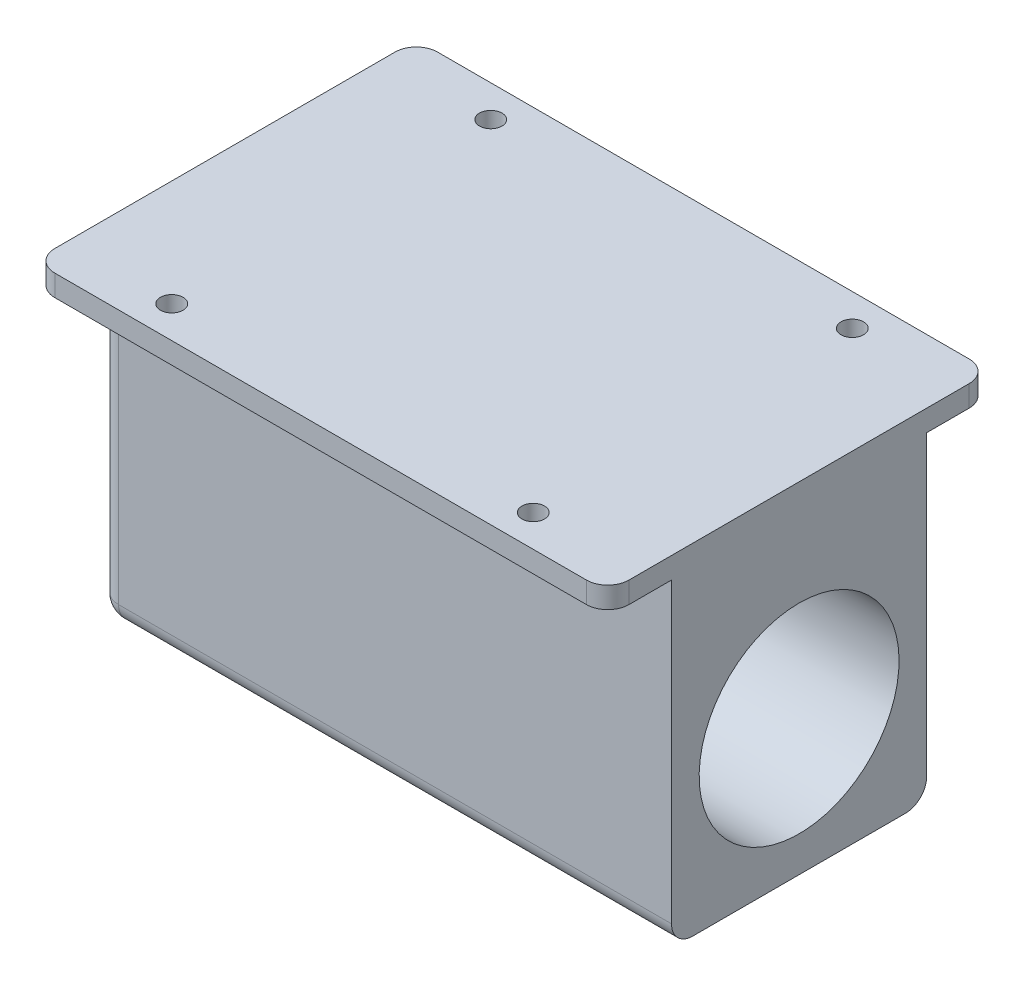
ISO-10303-21;
HEADER;
FILE_DESCRIPTION(('STEP AP214'),'2;1');
FILE_NAME('part.step','',(''),(''),'','','');
FILE_SCHEMA(('AUTOMOTIVE_DESIGN { 1 0 10303 214 1 1 1 1 }'));
ENDSEC;
DATA;
#1=APPLICATION_CONTEXT('core data for automotive mechanical design processes');
#2=APPLICATION_PROTOCOL_DEFINITION('international standard','automotive_design',2000,#1);
#3=PRODUCT_CONTEXT('',#1,'mechanical');
#4=PRODUCT('Part','Part','',(#3));
#5=PRODUCT_RELATED_PRODUCT_CATEGORY('part','',(#4));
#6=PRODUCT_DEFINITION_FORMATION('','',#4);
#7=PRODUCT_DEFINITION_CONTEXT('part definition',#1,'design');
#8=PRODUCT_DEFINITION('design','',#6,#7);
#9=PRODUCT_DEFINITION_SHAPE('','',#8);
#10=(LENGTH_UNIT() NAMED_UNIT(*) SI_UNIT(.MILLI.,.METRE.));
#11=(NAMED_UNIT(*) PLANE_ANGLE_UNIT() SI_UNIT($,.RADIAN.));
#12=(NAMED_UNIT(*) SI_UNIT($,.STERADIAN.) SOLID_ANGLE_UNIT());
#13=UNCERTAINTY_MEASURE_WITH_UNIT(LENGTH_MEASURE(1.E-05),#10,'distance_accuracy_value','');
#14=(GEOMETRIC_REPRESENTATION_CONTEXT(3) GLOBAL_UNCERTAINTY_ASSIGNED_CONTEXT((#13)) GLOBAL_UNIT_ASSIGNED_CONTEXT((#10,
#11,#12)) REPRESENTATION_CONTEXT('',''));
#15=CARTESIAN_POINT('',(0.,0.,0.));
#16=DIRECTION('',(0.,0.,1.));
#17=DIRECTION('',(1.,0.,0.));
#18=AXIS2_PLACEMENT_3D('',#15,#16,#17);
#19=CARTESIAN_POINT('',(0.,0.,60.));
#20=DIRECTION('',(0.,0.,1.));
#21=DIRECTION('',(1.,0.,0.));
#22=AXIS2_PLACEMENT_3D('',#19,#20,#21);
#23=PLANE('',#22);
#24=DIRECTION('',(0.,-1.,0.));
#25=VECTOR('',#24,1.);
#26=CARTESIAN_POINT('',(5.00000000000001,-80.,60.));
#27=LINE('',#26,#25);
#28=CARTESIAN_POINT('',(5.,-5.,60.));
#29=VERTEX_POINT('',#28);
#30=CARTESIAN_POINT('',(5.00000000000001,-75.,60.));
#31=VERTEX_POINT('',#30);
#32=EDGE_CURVE('E261',#29,#31,#27,.T.);
#33=ORIENTED_EDGE('',*,*,#32,.T.);
#34=DIRECTION('',(1.,0.,0.));
#35=VECTOR('',#34,1.);
#36=CARTESIAN_POINT('',(135.,-75.,60.));
#37=LINE('',#36,#35);
#38=CARTESIAN_POINT('',(135.,-75.,60.));
#39=VERTEX_POINT('',#38);
#40=EDGE_CURVE('E199',#31,#39,#37,.T.);
#41=ORIENTED_EDGE('',*,*,#40,.T.);
#42=DIRECTION('',(0.,1.,0.));
#43=VECTOR('',#42,1.);
#44=CARTESIAN_POINT('',(135.,-80.,60.));
#45=LINE('',#44,#43);
#46=CARTESIAN_POINT('',(135.,-4.99999999999999,60.));
#47=VERTEX_POINT('',#46);
#48=EDGE_CURVE('E184',#39,#47,#45,.T.);
#49=ORIENTED_EDGE('',*,*,#48,.T.);
#50=DIRECTION('',(-1.,0.,0.));
#51=VECTOR('',#50,1.);
#52=CARTESIAN_POINT('',(0.,-5.,60.));
#53=LINE('',#52,#51);
#54=EDGE_CURVE('E191',#47,#29,#53,.T.);
#55=ORIENTED_EDGE('',*,*,#54,.T.);
#56=EDGE_LOOP('',(#33,#41,#49,#55));
#57=FACE_BOUND('',#56,.T.);
#58=ADVANCED_FACE('F43',(#57),#23,.T.);
#59=CARTESIAN_POINT('',(0.,0.,60.));
#60=DIRECTION('',(1.,0.,0.));
#61=DIRECTION('',(0.,1.,0.));
#62=AXIS2_PLACEMENT_3D('',#59,#60,#61);
#63=PLANE('',#62);
#64=DIRECTION('',(0.,0.,-1.));
#65=VECTOR('',#64,1.);
#66=CARTESIAN_POINT('',(0.,0.,60.));
#67=LINE('',#66,#65);
#68=CARTESIAN_POINT('',(0.,0.,70.));
#69=VERTEX_POINT('',#68);
#70=CARTESIAN_POINT('',(0.,0.,-9.99999999999998));
#71=VERTEX_POINT('',#70);
#72=EDGE_CURVE('E200',#69,#71,#67,.T.);
#73=ORIENTED_EDGE('',*,*,#72,.T.);
#74=DIRECTION('',(0.,1.,0.));
#75=VECTOR('',#74,1.);
#76=CARTESIAN_POINT('',(0.,-5.,-9.99999999999998));
#77=LINE('',#76,#75);
#78=CARTESIAN_POINT('',(0.,-5.,-9.99999999999998));
#79=VERTEX_POINT('',#78);
#80=EDGE_CURVE('E11',#71,#79,#77,.F.);
#81=ORIENTED_EDGE('',*,*,#80,.T.);
#82=DIRECTION('',(0.,0.,1.));
#83=VECTOR('',#82,1.);
#84=CARTESIAN_POINT('',(0.,-5.,-15.));
#85=LINE('',#84,#83);
#86=CARTESIAN_POINT('',(0.,-5.,4.99999999999999));
#87=VERTEX_POINT('',#86);
#88=EDGE_CURVE('E381',#79,#87,#85,.T.);
#89=ORIENTED_EDGE('',*,*,#88,.T.);
#90=DIRECTION('',(0.,-1.,0.));
#91=VECTOR('',#90,1.);
#92=CARTESIAN_POINT('',(0.,0.,5.));
#93=LINE('',#92,#91);
#94=CARTESIAN_POINT('',(0.,-75.,5.));
#95=VERTEX_POINT('',#94);
#96=EDGE_CURVE('E282',#87,#95,#93,.T.);
#97=ORIENTED_EDGE('',*,*,#96,.T.);
#98=DIRECTION('',(0.,0.,-1.));
#99=VECTOR('',#98,1.);
#100=CARTESIAN_POINT('',(0.,-75.,60.));
#101=LINE('',#100,#99);
#102=CARTESIAN_POINT('',(0.,-75.,55.));
#103=VERTEX_POINT('',#102);
#104=EDGE_CURVE('E310',#95,#103,#101,.F.);
#105=ORIENTED_EDGE('',*,*,#104,.T.);
#106=DIRECTION('',(0.,-1.,0.));
#107=VECTOR('',#106,1.);
#108=CARTESIAN_POINT('',(0.,-5.,55.));
#109=LINE('',#108,#107);
#110=CARTESIAN_POINT('',(0.,-5.,55.));
#111=VERTEX_POINT('',#110);
#112=EDGE_CURVE('E285',#103,#111,#109,.F.);
#113=ORIENTED_EDGE('',*,*,#112,.T.);
#114=DIRECTION('',(0.,0.,1.));
#115=VECTOR('',#114,1.);
#116=CARTESIAN_POINT('',(0.,-5.,75.));
#117=LINE('',#116,#115);
#118=CARTESIAN_POINT('',(0.,-5.,70.));
#119=VERTEX_POINT('',#118);
#120=EDGE_CURVE('E207',#111,#119,#117,.T.);
#121=ORIENTED_EDGE('',*,*,#120,.T.);
#122=DIRECTION('',(0.,1.,0.));
#123=VECTOR('',#122,1.);
#124=CARTESIAN_POINT('',(0.,0.,70.));
#125=LINE('',#124,#123);
#126=EDGE_CURVE('E51',#119,#69,#125,.T.);
#127=ORIENTED_EDGE('',*,*,#126,.T.);
#128=EDGE_LOOP('',(#73,#81,#89,#97,#105,#113,#121,#127));
#129=FACE_BOUND('',#128,.T.);
#130=ADVANCED_FACE('F356',(#129),#63,.F.);
#131=CARTESIAN_POINT('',(0.,-80.,60.));
#132=DIRECTION('',(0.,1.,0.));
#133=DIRECTION('',(0.,0.,1.));
#134=AXIS2_PLACEMENT_3D('',#131,#132,#133);
#135=PLANE('',#134);
#136=DIRECTION('',(0.,0.,-1.));
#137=VECTOR('',#136,1.);
#138=CARTESIAN_POINT('',(135.,-80.,60.));
#139=LINE('',#138,#137);
#140=CARTESIAN_POINT('',(135.,-80.,55.));
#141=VERTEX_POINT('',#140);
#142=CARTESIAN_POINT('',(135.,-80.,5.));
#143=VERTEX_POINT('',#142);
#144=EDGE_CURVE('E258',#141,#143,#139,.T.);
#145=ORIENTED_EDGE('',*,*,#144,.F.);
#146=DIRECTION('',(1.,0.,0.));
#147=VECTOR('',#146,1.);
#148=CARTESIAN_POINT('',(5.00000000000001,-80.,55.));
#149=LINE('',#148,#147);
#150=CARTESIAN_POINT('',(5.00000000000001,-80.,55.));
#151=VERTEX_POINT('',#150);
#152=EDGE_CURVE('E302',#141,#151,#149,.F.);
#153=ORIENTED_EDGE('',*,*,#152,.T.);
#154=DIRECTION('',(0.,0.,-1.));
#155=VECTOR('',#154,1.);
#156=CARTESIAN_POINT('',(5.00000000000001,-80.,60.));
#157=LINE('',#156,#155);
#158=CARTESIAN_POINT('',(5.00000000000001,-80.,5.));
#159=VERTEX_POINT('',#158);
#160=EDGE_CURVE('E298',#151,#159,#157,.T.);
#161=ORIENTED_EDGE('',*,*,#160,.T.);
#162=DIRECTION('',(1.,0.,0.));
#163=VECTOR('',#162,1.);
#164=CARTESIAN_POINT('',(0.,-80.,5.));
#165=LINE('',#164,#163);
#166=EDGE_CURVE('E300',#159,#143,#165,.T.);
#167=ORIENTED_EDGE('',*,*,#166,.T.);
#168=EDGE_LOOP('',(#145,#153,#161,#167));
#169=FACE_BOUND('',#168,.T.);
#170=ADVANCED_FACE('F432',(#169),#135,.F.);
#171=CARTESIAN_POINT('',(135.,-80.,60.));
#172=DIRECTION('',(-1.,0.,0.));
#173=DIRECTION('',(0.,-1.,0.));
#174=AXIS2_PLACEMENT_3D('',#171,#172,#173);
#175=PLANE('',#174);
#176=CARTESIAN_POINT('',(135.,-48.18,30.));
#177=DIRECTION('',(1.,0.,0.));
#178=DIRECTION('',(0.,1.,0.));
#179=AXIS2_PLACEMENT_3D('',#176,#177,#178);
#180=CIRCLE('',#179,23.5);
#181=CARTESIAN_POINT('',(135.,-24.68,30.));
#182=VERTEX_POINT('',#181);
#183=EDGE_CURVE('E214',#182,#182,#180,.T.);
#184=ORIENTED_EDGE('',*,*,#183,.F.);
#185=EDGE_LOOP('',(#184));
#186=FACE_BOUND('',#185,.T.);
#187=DIRECTION('',(0.,0.,-1.));
#188=VECTOR('',#187,1.);
#189=CARTESIAN_POINT('',(135.,0.,60.));
#190=LINE('',#189,#188);
#191=CARTESIAN_POINT('',(135.,0.,70.));
#192=VERTEX_POINT('',#191);
#193=CARTESIAN_POINT('',(135.,0.,-9.99999999999999));
#194=VERTEX_POINT('',#193);
#195=EDGE_CURVE('E255',#192,#194,#190,.T.);
#196=ORIENTED_EDGE('',*,*,#195,.F.);
#197=DIRECTION('',(0.,1.,0.));
#198=VECTOR('',#197,1.);
#199=CARTESIAN_POINT('',(135.,-4.99999999999999,70.));
#200=LINE('',#199,#198);
#201=CARTESIAN_POINT('',(135.,-4.99999999999999,70.));
#202=VERTEX_POINT('',#201);
#203=EDGE_CURVE('E186',#192,#202,#200,.F.);
#204=ORIENTED_EDGE('',*,*,#203,.T.);
#205=DIRECTION('',(0.,0.,-1.));
#206=VECTOR('',#205,1.);
#207=CARTESIAN_POINT('',(135.,-4.99999999999999,60.));
#208=LINE('',#207,#206);
#209=EDGE_CURVE('E180',#202,#47,#208,.T.);
#210=ORIENTED_EDGE('',*,*,#209,.T.);
#211=ORIENTED_EDGE('',*,*,#48,.F.);
#212=CARTESIAN_POINT('',(135.,-75.,55.));
#213=DIRECTION('',(-1.,0.,0.));
#214=DIRECTION('',(0.,-1.,0.));
#215=AXIS2_PLACEMENT_3D('',#212,#213,#214);
#216=CIRCLE('',#215,5.);
#217=EDGE_CURVE('E296',#39,#141,#216,.F.);
#218=ORIENTED_EDGE('',*,*,#217,.T.);
#219=ORIENTED_EDGE('',*,*,#144,.T.);
#220=CARTESIAN_POINT('',(135.,-75.,5.));
#221=DIRECTION('',(-1.,0.,0.));
#222=DIRECTION('',(0.,-1.,0.));
#223=AXIS2_PLACEMENT_3D('',#220,#221,#222);
#224=CIRCLE('',#223,5.);
#225=CARTESIAN_POINT('',(135.,-75.,0.));
#226=VERTEX_POINT('',#225);
#227=EDGE_CURVE('E294',#143,#226,#224,.F.);
#228=ORIENTED_EDGE('',*,*,#227,.T.);
#229=DIRECTION('',(0.,1.,0.));
#230=VECTOR('',#229,1.);
#231=CARTESIAN_POINT('',(135.,-80.,0.));
#232=LINE('',#231,#230);
#233=CARTESIAN_POINT('',(135.,-4.99999999999999,0.));
#234=VERTEX_POINT('',#233);
#235=EDGE_CURVE('E201',#226,#234,#232,.T.);
#236=ORIENTED_EDGE('',*,*,#235,.T.);
#237=DIRECTION('',(0.,0.,-1.));
#238=VECTOR('',#237,1.);
#239=CARTESIAN_POINT('',(135.,-4.99999999999999,0.));
#240=LINE('',#239,#238);
#241=CARTESIAN_POINT('',(135.,-4.99999999999999,-9.99999999999999));
#242=VERTEX_POINT('',#241);
#243=EDGE_CURVE('E373',#234,#242,#240,.T.);
#244=ORIENTED_EDGE('',*,*,#243,.T.);
#245=DIRECTION('',(0.,1.,0.));
#246=VECTOR('',#245,1.);
#247=CARTESIAN_POINT('',(135.,0.,-9.99999999999999));
#248=LINE('',#247,#246);
#249=EDGE_CURVE('E338',#242,#194,#248,.T.);
#250=ORIENTED_EDGE('',*,*,#249,.T.);
#251=EDGE_LOOP('',(#196,#204,#210,#211,#218,#219,#228,#236,#244,#250));
#252=FACE_BOUND('',#251,.T.);
#253=ADVANCED_FACE('F183',(#186,#252),#175,.F.);
#254=CARTESIAN_POINT('',(0.,0.,60.));
#255=DIRECTION('',(0.,-1.,0.));
#256=DIRECTION('',(1.,0.,0.));
#257=AXIS2_PLACEMENT_3D('',#254,#255,#256);
#258=PLANE('',#257);
#259=CARTESIAN_POINT('',(110.,0.,-7.49999999999999));
#260=DIRECTION('',(0.,-1.,0.));
#261=DIRECTION('',(1.,0.,0.));
#262=AXIS2_PLACEMENT_3D('',#259,#260,#261);
#263=CIRCLE('',#262,2.65);
#264=CARTESIAN_POINT('',(112.65,0.,-7.49999999999999));
#265=VERTEX_POINT('',#264);
#266=EDGE_CURVE('E276',#265,#265,#263,.T.);
#267=ORIENTED_EDGE('',*,*,#266,.T.);
#268=EDGE_LOOP('',(#267));
#269=FACE_BOUND('',#268,.T.);
#270=CARTESIAN_POINT('',(25.,0.,-7.49999999999999));
#271=DIRECTION('',(0.,-1.,0.));
#272=DIRECTION('',(1.,0.,0.));
#273=AXIS2_PLACEMENT_3D('',#270,#271,#272);
#274=CIRCLE('',#273,2.65);
#275=CARTESIAN_POINT('',(27.65,0.,-7.49999999999999));
#276=VERTEX_POINT('',#275);
#277=EDGE_CURVE('E271',#276,#276,#274,.T.);
#278=ORIENTED_EDGE('',*,*,#277,.T.);
#279=EDGE_LOOP('',(#278));
#280=FACE_BOUND('',#279,.T.);
#281=CARTESIAN_POINT('',(110.,0.,67.5));
#282=DIRECTION('',(0.,-1.,0.));
#283=DIRECTION('',(1.,0.,0.));
#284=AXIS2_PLACEMENT_3D('',#281,#282,#283);
#285=CIRCLE('',#284,2.65);
#286=CARTESIAN_POINT('',(112.65,0.,67.5));
#287=VERTEX_POINT('',#286);
#288=EDGE_CURVE('E266',#287,#287,#285,.T.);
#289=ORIENTED_EDGE('',*,*,#288,.T.);
#290=EDGE_LOOP('',(#289));
#291=FACE_BOUND('',#290,.T.);
#292=CARTESIAN_POINT('',(25.,0.,67.5));
#293=DIRECTION('',(0.,-1.,0.));
#294=DIRECTION('',(1.,0.,0.));
#295=AXIS2_PLACEMENT_3D('',#292,#293,#294);
#296=CIRCLE('',#295,2.65);
#297=CARTESIAN_POINT('',(27.65,0.,67.5));
#298=VERTEX_POINT('',#297);
#299=EDGE_CURVE('E262',#298,#298,#296,.T.);
#300=ORIENTED_EDGE('',*,*,#299,.T.);
#301=EDGE_LOOP('',(#300));
#302=FACE_BOUND('',#301,.T.);
#303=DIRECTION('',(1.,0.,0.));
#304=VECTOR('',#303,1.);
#305=CARTESIAN_POINT('',(135.,0.,75.));
#306=LINE('',#305,#304);
#307=CARTESIAN_POINT('',(5.,0.,75.));
#308=VERTEX_POINT('',#307);
#309=CARTESIAN_POINT('',(130.,0.,75.));
#310=VERTEX_POINT('',#309);
#311=EDGE_CURVE('E190',#308,#310,#306,.T.);
#312=ORIENTED_EDGE('',*,*,#311,.T.);
#313=CARTESIAN_POINT('',(130.,0.,70.));
#314=DIRECTION('',(0.,-1.,0.));
#315=DIRECTION('',(1.,0.,0.));
#316=AXIS2_PLACEMENT_3D('',#313,#314,#315);
#317=CIRCLE('',#316,5.);
#318=EDGE_CURVE('E336',#310,#192,#317,.F.);
#319=ORIENTED_EDGE('',*,*,#318,.T.);
#320=ORIENTED_EDGE('',*,*,#195,.T.);
#321=CARTESIAN_POINT('',(130.,0.,-9.99999999999999));
#322=DIRECTION('',(0.,-1.,0.));
#323=DIRECTION('',(1.,0.,0.));
#324=AXIS2_PLACEMENT_3D('',#321,#322,#323);
#325=CIRCLE('',#324,5.);
#326=CARTESIAN_POINT('',(130.,0.,-15.));
#327=VERTEX_POINT('',#326);
#328=EDGE_CURVE('E334',#194,#327,#325,.F.);
#329=ORIENTED_EDGE('',*,*,#328,.T.);
#330=DIRECTION('',(-1.,0.,0.));
#331=VECTOR('',#330,1.);
#332=CARTESIAN_POINT('',(135.,0.,-15.));
#333=LINE('',#332,#331);
#334=CARTESIAN_POINT('',(5.,0.,-15.));
#335=VERTEX_POINT('',#334);
#336=EDGE_CURVE('E365',#327,#335,#333,.T.);
#337=ORIENTED_EDGE('',*,*,#336,.T.);
#338=CARTESIAN_POINT('',(5.,0.,-9.99999999999998));
#339=DIRECTION('',(0.,-1.,0.));
#340=DIRECTION('',(1.,0.,0.));
#341=AXIS2_PLACEMENT_3D('',#338,#339,#340);
#342=CIRCLE('',#341,5.);
#343=EDGE_CURVE('E332',#335,#71,#342,.F.);
#344=ORIENTED_EDGE('',*,*,#343,.T.);
#345=ORIENTED_EDGE('',*,*,#72,.F.);
#346=CARTESIAN_POINT('',(5.,0.,70.));
#347=DIRECTION('',(0.,-1.,0.));
#348=DIRECTION('',(1.,0.,0.));
#349=AXIS2_PLACEMENT_3D('',#346,#347,#348);
#350=CIRCLE('',#349,5.);
#351=EDGE_CURVE('E330',#69,#308,#350,.F.);
#352=ORIENTED_EDGE('',*,*,#351,.T.);
#353=EDGE_LOOP('',(#312,#319,#320,#329,#337,#344,#345,#352));
#354=FACE_BOUND('',#353,.T.);
#355=ADVANCED_FACE('F361',(#269,#280,#291,#302,#354),#258,.F.);
#356=CARTESIAN_POINT('',(0.,0.,0.));
#357=DIRECTION('',(0.,0.,1.));
#358=DIRECTION('',(1.,0.,0.));
#359=AXIS2_PLACEMENT_3D('',#356,#357,#358);
#360=PLANE('',#359);
#361=ORIENTED_EDGE('',*,*,#235,.F.);
#362=DIRECTION('',(1.,0.,0.));
#363=VECTOR('',#362,1.);
#364=CARTESIAN_POINT('',(0.,-75.,0.));
#365=LINE('',#364,#363);
#366=CARTESIAN_POINT('',(5.00000000000001,-75.,0.));
#367=VERTEX_POINT('',#366);
#368=EDGE_CURVE('E306',#226,#367,#365,.F.);
#369=ORIENTED_EDGE('',*,*,#368,.T.);
#370=DIRECTION('',(0.,-1.,0.));
#371=VECTOR('',#370,1.);
#372=CARTESIAN_POINT('',(5.,0.,0.));
#373=LINE('',#372,#371);
#374=CARTESIAN_POINT('',(5.,-5.,0.));
#375=VERTEX_POINT('',#374);
#376=EDGE_CURVE('E287',#367,#375,#373,.F.);
#377=ORIENTED_EDGE('',*,*,#376,.T.);
#378=DIRECTION('',(1.,0.,0.));
#379=VECTOR('',#378,1.);
#380=CARTESIAN_POINT('',(0.,-5.,0.));
#381=LINE('',#380,#379);
#382=EDGE_CURVE('E376',#375,#234,#381,.T.);
#383=ORIENTED_EDGE('',*,*,#382,.T.);
#384=EDGE_LOOP('',(#361,#369,#377,#383));
#385=FACE_BOUND('',#384,.T.);
#386=ADVANCED_FACE('F438',(#385),#360,.F.);
#387=CARTESIAN_POINT('',(-0.00100000000002876,-48.18,30.));
#388=DIRECTION('',(1.,0.,0.));
#389=DIRECTION('',(0.,1.,0.));
#390=AXIS2_PLACEMENT_3D('',#387,#388,#389);
#391=CYLINDRICAL_SURFACE('',#390,23.5);
#392=ORIENTED_EDGE('',*,*,#183,.T.);
#393=EDGE_LOOP('',(#392));
#394=FACE_BOUND('',#393,.T.);
#395=CARTESIAN_POINT('',(68.3,-48.18,30.));
#396=DIRECTION('',(1.,0.,0.));
#397=DIRECTION('',(0.,0.,-1.));
#398=AXIS2_PLACEMENT_3D('',#395,#396,#397);
#399=CIRCLE('',#398,23.5);
#400=CARTESIAN_POINT('',(68.3,-48.18,6.5));
#401=VERTEX_POINT('',#400);
#402=EDGE_CURVE('E217',#401,#401,#399,.F.);
#403=ORIENTED_EDGE('',*,*,#402,.T.);
#404=EDGE_LOOP('',(#403));
#405=FACE_BOUND('',#404,.T.);
#406=ADVANCED_FACE('F441',(#394,#405),#391,.F.);
#407=CARTESIAN_POINT('',(24.1086016209677,-76.68,1.49999999999999));
#408=DIRECTION('',(0.,-1.,0.));
#409=DIRECTION('',(0.,0.,-1.));
#410=AXIS2_PLACEMENT_3D('',#407,#408,#409);
#411=PLANE('',#410);
#412=DIRECTION('',(1.,0.,0.));
#413=VECTOR('',#412,1.);
#414=CARTESIAN_POINT('',(24.1086016209677,-76.68,58.5));
#415=LINE('',#414,#413);
#416=CARTESIAN_POINT('',(13.8,-76.68,58.5));
#417=VERTEX_POINT('',#416);
#418=CARTESIAN_POINT('',(68.3,-76.68,58.5));
#419=VERTEX_POINT('',#418);
#420=EDGE_CURVE('E226',#417,#419,#415,.T.);
#421=ORIENTED_EDGE('',*,*,#420,.T.);
#422=DIRECTION('',(0.,0.,1.));
#423=VECTOR('',#422,1.);
#424=CARTESIAN_POINT('',(68.3,-76.68,1.49999999999999));
#425=LINE('',#424,#423);
#426=CARTESIAN_POINT('',(68.3,-76.68,1.49999999999999));
#427=VERTEX_POINT('',#426);
#428=EDGE_CURVE('E235',#427,#419,#425,.T.);
#429=ORIENTED_EDGE('',*,*,#428,.F.);
#430=DIRECTION('',(1.,0.,0.));
#431=VECTOR('',#430,1.);
#432=CARTESIAN_POINT('',(68.3,-76.68,1.49999999999999));
#433=LINE('',#432,#431);
#434=CARTESIAN_POINT('',(13.8,-76.68,1.49999999999999));
#435=VERTEX_POINT('',#434);
#436=EDGE_CURVE('E222',#435,#427,#433,.T.);
#437=ORIENTED_EDGE('',*,*,#436,.F.);
#438=DIRECTION('',(0.,0.,1.));
#439=VECTOR('',#438,1.);
#440=CARTESIAN_POINT('',(13.8,-76.68,1.49999999999999));
#441=LINE('',#440,#439);
#442=EDGE_CURVE('E245',#435,#417,#441,.T.);
#443=ORIENTED_EDGE('',*,*,#442,.T.);
#444=EDGE_LOOP('',(#421,#429,#437,#443));
#445=FACE_BOUND('',#444,.T.);
#446=ADVANCED_FACE('F681',(#445),#411,.F.);
#447=CARTESIAN_POINT('',(13.8,-76.68,1.49999999999999));
#448=DIRECTION('',(-1.,0.,0.));
#449=DIRECTION('',(0.,0.,1.));
#450=AXIS2_PLACEMENT_3D('',#447,#448,#449);
#451=PLANE('',#450);
#452=DIRECTION('',(0.,-1.,0.));
#453=VECTOR('',#452,1.);
#454=CARTESIAN_POINT('',(13.8,-76.68,58.5));
#455=LINE('',#454,#453);
#456=CARTESIAN_POINT('',(13.8,-19.68,58.5));
#457=VERTEX_POINT('',#456);
#458=EDGE_CURVE('E241',#457,#417,#455,.T.);
#459=ORIENTED_EDGE('',*,*,#458,.T.);
#460=ORIENTED_EDGE('',*,*,#442,.F.);
#461=DIRECTION('',(0.,-1.,0.));
#462=VECTOR('',#461,1.);
#463=CARTESIAN_POINT('',(13.8,-76.68,1.49999999999999));
#464=LINE('',#463,#462);
#465=CARTESIAN_POINT('',(13.8,-19.68,1.49999999999999));
#466=VERTEX_POINT('',#465);
#467=EDGE_CURVE('E232',#466,#435,#464,.T.);
#468=ORIENTED_EDGE('',*,*,#467,.F.);
#469=DIRECTION('',(0.,0.,1.));
#470=VECTOR('',#469,1.);
#471=CARTESIAN_POINT('',(13.8,-19.68,1.49999999999999));
#472=LINE('',#471,#470);
#473=EDGE_CURVE('E247',#466,#457,#472,.T.);
#474=ORIENTED_EDGE('',*,*,#473,.T.);
#475=EDGE_LOOP('',(#459,#460,#468,#474));
#476=FACE_BOUND('',#475,.T.);
#477=ADVANCED_FACE('F715',(#476),#451,.F.);
#478=CARTESIAN_POINT('',(13.8,-19.68,1.49999999999999));
#479=DIRECTION('',(0.,1.,0.));
#480=DIRECTION('',(0.,0.,1.));
#481=AXIS2_PLACEMENT_3D('',#478,#479,#480);
#482=PLANE('',#481);
#483=DIRECTION('',(-1.,0.,0.));
#484=VECTOR('',#483,1.);
#485=CARTESIAN_POINT('',(13.8,-19.68,58.5));
#486=LINE('',#485,#484);
#487=CARTESIAN_POINT('',(68.3,-19.68,58.5));
#488=VERTEX_POINT('',#487);
#489=EDGE_CURVE('E238',#488,#457,#486,.T.);
#490=ORIENTED_EDGE('',*,*,#489,.T.);
#491=ORIENTED_EDGE('',*,*,#473,.F.);
#492=DIRECTION('',(-1.,0.,0.));
#493=VECTOR('',#492,1.);
#494=CARTESIAN_POINT('',(13.8,-19.68,1.49999999999999));
#495=LINE('',#494,#493);
#496=CARTESIAN_POINT('',(68.3,-19.68,1.49999999999999));
#497=VERTEX_POINT('',#496);
#498=EDGE_CURVE('E229',#497,#466,#495,.T.);
#499=ORIENTED_EDGE('',*,*,#498,.F.);
#500=DIRECTION('',(0.,0.,1.));
#501=VECTOR('',#500,1.);
#502=CARTESIAN_POINT('',(68.3,-19.68,1.49999999999999));
#503=LINE('',#502,#501);
#504=EDGE_CURVE('E249',#497,#488,#503,.T.);
#505=ORIENTED_EDGE('',*,*,#504,.T.);
#506=EDGE_LOOP('',(#490,#491,#499,#505));
#507=FACE_BOUND('',#506,.T.);
#508=ADVANCED_FACE('F707',(#507),#482,.F.);
#509=CARTESIAN_POINT('',(68.3,-19.68,1.49999999999999));
#510=DIRECTION('',(1.,0.,0.));
#511=DIRECTION('',(0.,0.,-1.));
#512=AXIS2_PLACEMENT_3D('',#509,#510,#511);
#513=PLANE('',#512);
#514=ORIENTED_EDGE('',*,*,#402,.F.);
#515=EDGE_LOOP('',(#514));
#516=FACE_BOUND('',#515,.T.);
#517=DIRECTION('',(0.,1.,0.));
#518=VECTOR('',#517,1.);
#519=CARTESIAN_POINT('',(68.3,-19.68,58.5));
#520=LINE('',#519,#518);
#521=EDGE_CURVE('E221',#419,#488,#520,.T.);
#522=ORIENTED_EDGE('',*,*,#521,.T.);
#523=ORIENTED_EDGE('',*,*,#504,.F.);
#524=DIRECTION('',(0.,1.,0.));
#525=VECTOR('',#524,1.);
#526=CARTESIAN_POINT('',(68.3,-19.68,1.49999999999999));
#527=LINE('',#526,#525);
#528=EDGE_CURVE('E225',#427,#497,#527,.T.);
#529=ORIENTED_EDGE('',*,*,#528,.F.);
#530=ORIENTED_EDGE('',*,*,#428,.T.);
#531=EDGE_LOOP('',(#522,#523,#529,#530));
#532=FACE_BOUND('',#531,.T.);
#533=ADVANCED_FACE('F436',(#516,#532),#513,.F.);
#534=CARTESIAN_POINT('',(0.,0.,1.49999999999999));
#535=DIRECTION('',(0.,0.,-1.));
#536=DIRECTION('',(-1.,0.,0.));
#537=AXIS2_PLACEMENT_3D('',#534,#535,#536);
#538=PLANE('',#537);
#539=ORIENTED_EDGE('',*,*,#436,.T.);
#540=ORIENTED_EDGE('',*,*,#528,.T.);
#541=ORIENTED_EDGE('',*,*,#498,.T.);
#542=ORIENTED_EDGE('',*,*,#467,.T.);
#543=EDGE_LOOP('',(#539,#540,#541,#542));
#544=FACE_BOUND('',#543,.T.);
#545=ADVANCED_FACE('F690',(#544),#538,.F.);
#546=CARTESIAN_POINT('',(0.,0.,58.5));
#547=DIRECTION('',(0.,0.,-1.));
#548=DIRECTION('',(-1.,0.,0.));
#549=AXIS2_PLACEMENT_3D('',#546,#547,#548);
#550=PLANE('',#549);
#551=ORIENTED_EDGE('',*,*,#420,.F.);
#552=ORIENTED_EDGE('',*,*,#458,.F.);
#553=ORIENTED_EDGE('',*,*,#489,.F.);
#554=ORIENTED_EDGE('',*,*,#521,.F.);
#555=EDGE_LOOP('',(#551,#552,#553,#554));
#556=FACE_BOUND('',#555,.T.);
#557=ADVANCED_FACE('F666',(#556),#550,.T.);
#558=CARTESIAN_POINT('',(135.,-4.99999999999999,-15.));
#559=DIRECTION('',(0.,0.,-1.));
#560=DIRECTION('',(-1.,0.,0.));
#561=AXIS2_PLACEMENT_3D('',#558,#559,#560);
#562=PLANE('',#561);
#563=ORIENTED_EDGE('',*,*,#336,.F.);
#564=DIRECTION('',(0.,1.,0.));
#565=VECTOR('',#564,1.);
#566=CARTESIAN_POINT('',(130.,-4.99999999999999,-15.));
#567=LINE('',#566,#565);
#568=CARTESIAN_POINT('',(130.,-4.99999999999999,-15.));
#569=VERTEX_POINT('',#568);
#570=EDGE_CURVE('E349',#327,#569,#567,.F.);
#571=ORIENTED_EDGE('',*,*,#570,.T.);
#572=DIRECTION('',(-1.,0.,0.));
#573=VECTOR('',#572,1.);
#574=CARTESIAN_POINT('',(135.,-4.99999999999999,-15.));
#575=LINE('',#574,#573);
#576=CARTESIAN_POINT('',(5.,-5.,-15.));
#577=VERTEX_POINT('',#576);
#578=EDGE_CURVE('E218',#569,#577,#575,.T.);
#579=ORIENTED_EDGE('',*,*,#578,.T.);
#580=DIRECTION('',(0.,1.,0.));
#581=VECTOR('',#580,1.);
#582=CARTESIAN_POINT('',(5.,0.,-15.));
#583=LINE('',#582,#581);
#584=EDGE_CURVE('E346',#577,#335,#583,.T.);
#585=ORIENTED_EDGE('',*,*,#584,.T.);
#586=EDGE_LOOP('',(#563,#571,#579,#585));
#587=FACE_BOUND('',#586,.T.);
#588=ADVANCED_FACE('F370',(#587),#562,.T.);
#589=CARTESIAN_POINT('',(0.,-5.,0.));
#590=DIRECTION('',(0.,1.,0.));
#591=DIRECTION('',(-1.,0.,0.));
#592=AXIS2_PLACEMENT_3D('',#589,#590,#591);
#593=PLANE('',#592);
#594=CARTESIAN_POINT('',(110.,-4.99999999999999,-7.49999999999999));
#595=DIRECTION('',(0.,-1.,0.));
#596=DIRECTION('',(0.,0.,-1.));
#597=AXIS2_PLACEMENT_3D('',#594,#595,#596);
#598=CIRCLE('',#597,5.49999999999999);
#599=CARTESIAN_POINT('',(110.,-4.99999999999999,-13.));
#600=VERTEX_POINT('',#599);
#601=EDGE_CURVE('E325',#600,#600,#598,.T.);
#602=ORIENTED_EDGE('',*,*,#601,.F.);
#603=EDGE_LOOP('',(#602));
#604=FACE_BOUND('',#603,.T.);
#605=CARTESIAN_POINT('',(25.,-5.,-7.49999999999999));
#606=DIRECTION('',(0.,-1.,0.));
#607=DIRECTION('',(0.,0.,-1.));
#608=AXIS2_PLACEMENT_3D('',#605,#606,#607);
#609=CIRCLE('',#608,5.49999999999999);
#610=CARTESIAN_POINT('',(25.,-5.,-13.));
#611=VERTEX_POINT('',#610);
#612=EDGE_CURVE('E279',#611,#611,#609,.T.);
#613=ORIENTED_EDGE('',*,*,#612,.F.);
#614=EDGE_LOOP('',(#613));
#615=FACE_BOUND('',#614,.T.);
#616=ORIENTED_EDGE('',*,*,#578,.F.);
#617=CARTESIAN_POINT('',(130.,-5.,-9.99999999999999));
#618=DIRECTION('',(0.,1.,0.));
#619=DIRECTION('',(-1.,0.,0.));
#620=AXIS2_PLACEMENT_3D('',#617,#618,#619);
#621=CIRCLE('',#620,5.);
#622=EDGE_CURVE('E352',#569,#242,#621,.F.);
#623=ORIENTED_EDGE('',*,*,#622,.T.);
#624=ORIENTED_EDGE('',*,*,#243,.F.);
#625=ORIENTED_EDGE('',*,*,#382,.F.);
#626=CARTESIAN_POINT('',(5.,-5.,5.));
#627=DIRECTION('',(0.,1.,0.));
#628=DIRECTION('',(-1.,0.,0.));
#629=AXIS2_PLACEMENT_3D('',#626,#627,#628);
#630=CIRCLE('',#629,5.);
#631=EDGE_CURVE('E290',#375,#87,#630,.T.);
#632=ORIENTED_EDGE('',*,*,#631,.T.);
#633=ORIENTED_EDGE('',*,*,#88,.F.);
#634=CARTESIAN_POINT('',(5.,-5.,-9.99999999999998));
#635=DIRECTION('',(0.,1.,0.));
#636=DIRECTION('',(-1.,0.,0.));
#637=AXIS2_PLACEMENT_3D('',#634,#635,#636);
#638=CIRCLE('',#637,5.);
#639=EDGE_CURVE('E63',#79,#577,#638,.F.);
#640=ORIENTED_EDGE('',*,*,#639,.T.);
#641=EDGE_LOOP('',(#616,#623,#624,#625,#632,#633,#640));
#642=FACE_BOUND('',#641,.T.);
#643=ADVANCED_FACE('F394',(#604,#615,#642),#593,.F.);
#644=CARTESIAN_POINT('',(135.,-4.99999999999999,75.));
#645=DIRECTION('',(0.,0.,1.));
#646=DIRECTION('',(1.,0.,0.));
#647=AXIS2_PLACEMENT_3D('',#644,#645,#646);
#648=PLANE('',#647);
#649=DIRECTION('',(1.,0.,0.));
#650=VECTOR('',#649,1.);
#651=CARTESIAN_POINT('',(135.,-4.99999999999999,75.));
#652=LINE('',#651,#650);
#653=CARTESIAN_POINT('',(5.,-5.,75.));
#654=VERTEX_POINT('',#653);
#655=CARTESIAN_POINT('',(130.,-4.99999999999999,75.));
#656=VERTEX_POINT('',#655);
#657=EDGE_CURVE('E210',#654,#656,#652,.T.);
#658=ORIENTED_EDGE('',*,*,#657,.T.);
#659=DIRECTION('',(0.,1.,0.));
#660=VECTOR('',#659,1.);
#661=CARTESIAN_POINT('',(130.,0.,75.));
#662=LINE('',#661,#660);
#663=EDGE_CURVE('E327',#656,#310,#662,.T.);
#664=ORIENTED_EDGE('',*,*,#663,.T.);
#665=ORIENTED_EDGE('',*,*,#311,.F.);
#666=DIRECTION('',(0.,1.,0.));
#667=VECTOR('',#666,1.);
#668=CARTESIAN_POINT('',(5.,-5.,75.));
#669=LINE('',#668,#667);
#670=EDGE_CURVE('E312',#308,#654,#669,.F.);
#671=ORIENTED_EDGE('',*,*,#670,.T.);
#672=EDGE_LOOP('',(#658,#664,#665,#671));
#673=FACE_BOUND('',#672,.T.);
#674=ADVANCED_FACE('F386',(#673),#648,.T.);
#675=CARTESIAN_POINT('',(0.,-5.,0.));
#676=DIRECTION('',(0.,-1.,0.));
#677=DIRECTION('',(1.,0.,0.));
#678=AXIS2_PLACEMENT_3D('',#675,#676,#677);
#679=PLANE('',#678);
#680=CARTESIAN_POINT('',(110.,-4.99999999999999,67.5));
#681=DIRECTION('',(0.,-1.,0.));
#682=DIRECTION('',(0.,0.,-1.));
#683=AXIS2_PLACEMENT_3D('',#680,#681,#682);
#684=CIRCLE('',#683,5.49999999999999);
#685=CARTESIAN_POINT('',(110.,-4.99999999999999,62.));
#686=VERTEX_POINT('',#685);
#687=EDGE_CURVE('E274',#686,#686,#684,.T.);
#688=ORIENTED_EDGE('',*,*,#687,.F.);
#689=EDGE_LOOP('',(#688));
#690=FACE_BOUND('',#689,.T.);
#691=CARTESIAN_POINT('',(25.,-5.,67.5));
#692=DIRECTION('',(0.,-1.,0.));
#693=DIRECTION('',(0.,0.,-1.));
#694=AXIS2_PLACEMENT_3D('',#691,#692,#693);
#695=CIRCLE('',#694,5.49999999999999);
#696=CARTESIAN_POINT('',(25.,-5.,62.));
#697=VERTEX_POINT('',#696);
#698=EDGE_CURVE('E269',#697,#697,#695,.T.);
#699=ORIENTED_EDGE('',*,*,#698,.F.);
#700=EDGE_LOOP('',(#699));
#701=FACE_BOUND('',#700,.T.);
#702=ORIENTED_EDGE('',*,*,#209,.F.);
#703=CARTESIAN_POINT('',(130.,-4.99999999999999,70.));
#704=DIRECTION('',(0.,-1.,0.));
#705=DIRECTION('',(1.,0.,0.));
#706=AXIS2_PLACEMENT_3D('',#703,#704,#705);
#707=CIRCLE('',#706,5.);
#708=EDGE_CURVE('E344',#202,#656,#707,.T.);
#709=ORIENTED_EDGE('',*,*,#708,.T.);
#710=ORIENTED_EDGE('',*,*,#657,.F.);
#711=CARTESIAN_POINT('',(5.,-5.,70.));
#712=DIRECTION('',(0.,-1.,0.));
#713=DIRECTION('',(1.,0.,0.));
#714=AXIS2_PLACEMENT_3D('',#711,#712,#713);
#715=CIRCLE('',#714,5.);
#716=EDGE_CURVE('E342',#654,#119,#715,.T.);
#717=ORIENTED_EDGE('',*,*,#716,.T.);
#718=ORIENTED_EDGE('',*,*,#120,.F.);
#719=CARTESIAN_POINT('',(5.,-5.,55.));
#720=DIRECTION('',(0.,-1.,0.));
#721=DIRECTION('',(1.,0.,0.));
#722=AXIS2_PLACEMENT_3D('',#719,#720,#721);
#723=CIRCLE('',#722,5.);
#724=EDGE_CURVE('E206',#111,#29,#723,.F.);
#725=ORIENTED_EDGE('',*,*,#724,.T.);
#726=ORIENTED_EDGE('',*,*,#54,.F.);
#727=EDGE_LOOP('',(#702,#709,#710,#717,#718,#725,#726));
#728=FACE_BOUND('',#727,.T.);
#729=ADVANCED_FACE('F203',(#690,#701,#728),#679,.T.);
#730=CARTESIAN_POINT('',(25.,-5.,67.5));
#731=DIRECTION('',(0.,-1.,0.));
#732=DIRECTION('',(0.,0.,-1.));
#733=AXIS2_PLACEMENT_3D('',#730,#731,#732);
#734=CYLINDRICAL_SURFACE('',#733,2.65);
#735=CARTESIAN_POINT('',(25.,-4.5,67.5));
#736=DIRECTION('',(0.,-1.,0.));
#737=DIRECTION('',(0.,0.,-1.));
#738=AXIS2_PLACEMENT_3D('',#735,#736,#737);
#739=CIRCLE('',#738,2.65);
#740=CARTESIAN_POINT('',(25.,-4.5,64.85));
#741=VERTEX_POINT('',#740);
#742=EDGE_CURVE('E265',#741,#741,#739,.T.);
#743=ORIENTED_EDGE('',*,*,#742,.T.);
#744=EDGE_LOOP('',(#743));
#745=FACE_BOUND('',#744,.T.);
#746=ORIENTED_EDGE('',*,*,#299,.F.);
#747=EDGE_LOOP('',(#746));
#748=FACE_BOUND('',#747,.T.);
#749=ADVANCED_FACE('F628',(#745,#748),#734,.F.);
#750=CARTESIAN_POINT('',(27.65,-4.5,67.5));
#751=DIRECTION('',(0.,1.,0.));
#752=DIRECTION('',(0.,0.,1.));
#753=AXIS2_PLACEMENT_3D('',#750,#751,#752);
#754=PLANE('',#753);
#755=ORIENTED_EDGE('',*,*,#742,.F.);
#756=EDGE_LOOP('',(#755));
#757=FACE_BOUND('',#756,.T.);
#758=CARTESIAN_POINT('',(25.,-4.5,67.5));
#759=DIRECTION('',(0.,-1.,0.));
#760=DIRECTION('',(0.,0.,-1.));
#761=AXIS2_PLACEMENT_3D('',#758,#759,#760);
#762=CIRCLE('',#761,5.5);
#763=CARTESIAN_POINT('',(25.,-4.5,62.));
#764=VERTEX_POINT('',#763);
#765=EDGE_CURVE('E849',#764,#764,#762,.T.);
#766=ORIENTED_EDGE('',*,*,#765,.T.);
#767=EDGE_LOOP('',(#766));
#768=FACE_BOUND('',#767,.T.);
#769=ADVANCED_FACE('F619',(#757,#768),#754,.F.);
#770=CARTESIAN_POINT('',(25.,-5.,67.5));
#771=DIRECTION('',(0.,-1.,0.));
#772=DIRECTION('',(0.,0.,-1.));
#773=AXIS2_PLACEMENT_3D('',#770,#771,#772);
#774=CYLINDRICAL_SURFACE('',#773,5.5);
#775=ORIENTED_EDGE('',*,*,#765,.F.);
#776=EDGE_LOOP('',(#775));
#777=FACE_BOUND('',#776,.T.);
#778=ORIENTED_EDGE('',*,*,#698,.T.);
#779=EDGE_LOOP('',(#778));
#780=FACE_BOUND('',#779,.T.);
#781=ADVANCED_FACE('F610',(#777,#780),#774,.F.);
#782=CARTESIAN_POINT('',(110.,-4.99999999999999,67.5));
#783=DIRECTION('',(0.,-1.,0.));
#784=DIRECTION('',(0.,0.,-1.));
#785=AXIS2_PLACEMENT_3D('',#782,#783,#784);
#786=CYLINDRICAL_SURFACE('',#785,2.65);
#787=CARTESIAN_POINT('',(110.,-4.49999999999999,67.5));
#788=DIRECTION('',(0.,-1.,0.));
#789=DIRECTION('',(0.,0.,-1.));
#790=AXIS2_PLACEMENT_3D('',#787,#788,#789);
#791=CIRCLE('',#790,2.65);
#792=CARTESIAN_POINT('',(110.,-4.49999999999999,64.85));
#793=VERTEX_POINT('',#792);
#794=EDGE_CURVE('E270',#793,#793,#791,.T.);
#795=ORIENTED_EDGE('',*,*,#794,.T.);
#796=EDGE_LOOP('',(#795));
#797=FACE_BOUND('',#796,.T.);
#798=ORIENTED_EDGE('',*,*,#288,.F.);
#799=EDGE_LOOP('',(#798));
#800=FACE_BOUND('',#799,.T.);
#801=ADVANCED_FACE('F601',(#797,#800),#786,.F.);
#802=CARTESIAN_POINT('',(112.65,-4.49999999999999,67.5));
#803=DIRECTION('',(0.,1.,0.));
#804=DIRECTION('',(0.,0.,1.));
#805=AXIS2_PLACEMENT_3D('',#802,#803,#804);
#806=PLANE('',#805);
#807=ORIENTED_EDGE('',*,*,#794,.F.);
#808=EDGE_LOOP('',(#807));
#809=FACE_BOUND('',#808,.T.);
#810=CARTESIAN_POINT('',(110.,-4.49999999999999,67.5));
#811=DIRECTION('',(0.,-1.,0.));
#812=DIRECTION('',(0.,0.,-1.));
#813=AXIS2_PLACEMENT_3D('',#810,#811,#812);
#814=CIRCLE('',#813,5.49999999999999);
#815=CARTESIAN_POINT('',(110.,-4.49999999999999,62.));
#816=VERTEX_POINT('',#815);
#817=EDGE_CURVE('E842',#816,#816,#814,.T.);
#818=ORIENTED_EDGE('',*,*,#817,.T.);
#819=EDGE_LOOP('',(#818));
#820=FACE_BOUND('',#819,.T.);
#821=ADVANCED_FACE('F592',(#809,#820),#806,.F.);
#822=CARTESIAN_POINT('',(110.,-4.99999999999999,67.5));
#823=DIRECTION('',(0.,-1.,0.));
#824=DIRECTION('',(0.,0.,-1.));
#825=AXIS2_PLACEMENT_3D('',#822,#823,#824);
#826=CYLINDRICAL_SURFACE('',#825,5.49999999999999);
#827=ORIENTED_EDGE('',*,*,#817,.F.);
#828=EDGE_LOOP('',(#827));
#829=FACE_BOUND('',#828,.T.);
#830=ORIENTED_EDGE('',*,*,#687,.T.);
#831=EDGE_LOOP('',(#830));
#832=FACE_BOUND('',#831,.T.);
#833=ADVANCED_FACE('F583',(#829,#832),#826,.F.);
#834=CARTESIAN_POINT('',(25.,-5.,-7.49999999999999));
#835=DIRECTION('',(0.,-1.,0.));
#836=DIRECTION('',(0.,0.,-1.));
#837=AXIS2_PLACEMENT_3D('',#834,#835,#836);
#838=CYLINDRICAL_SURFACE('',#837,2.65);
#839=CARTESIAN_POINT('',(25.,-4.5,-7.49999999999999));
#840=DIRECTION('',(0.,-1.,0.));
#841=DIRECTION('',(0.,0.,-1.));
#842=AXIS2_PLACEMENT_3D('',#839,#840,#841);
#843=CIRCLE('',#842,2.65);
#844=CARTESIAN_POINT('',(25.,-4.5,-10.15));
#845=VERTEX_POINT('',#844);
#846=EDGE_CURVE('E275',#845,#845,#843,.T.);
#847=ORIENTED_EDGE('',*,*,#846,.T.);
#848=EDGE_LOOP('',(#847));
#849=FACE_BOUND('',#848,.T.);
#850=ORIENTED_EDGE('',*,*,#277,.F.);
#851=EDGE_LOOP('',(#850));
#852=FACE_BOUND('',#851,.T.);
#853=ADVANCED_FACE('F574',(#849,#852),#838,.F.);
#854=CARTESIAN_POINT('',(27.65,-4.5,-7.49999999999999));
#855=DIRECTION('',(0.,1.,0.));
#856=DIRECTION('',(0.,0.,1.));
#857=AXIS2_PLACEMENT_3D('',#854,#855,#856);
#858=PLANE('',#857);
#859=ORIENTED_EDGE('',*,*,#846,.F.);
#860=EDGE_LOOP('',(#859));
#861=FACE_BOUND('',#860,.T.);
#862=CARTESIAN_POINT('',(25.,-4.5,-7.49999999999999));
#863=DIRECTION('',(0.,-1.,0.));
#864=DIRECTION('',(0.,0.,-1.));
#865=AXIS2_PLACEMENT_3D('',#862,#863,#864);
#866=CIRCLE('',#865,5.5);
#867=CARTESIAN_POINT('',(25.,-4.5,-13.));
#868=VERTEX_POINT('',#867);
#869=EDGE_CURVE('E831',#868,#868,#866,.T.);
#870=ORIENTED_EDGE('',*,*,#869,.T.);
#871=EDGE_LOOP('',(#870));
#872=FACE_BOUND('',#871,.T.);
#873=ADVANCED_FACE('F565',(#861,#872),#858,.F.);
#874=CARTESIAN_POINT('',(25.,-5.,-7.49999999999999));
#875=DIRECTION('',(0.,-1.,0.));
#876=DIRECTION('',(0.,0.,-1.));
#877=AXIS2_PLACEMENT_3D('',#874,#875,#876);
#878=CYLINDRICAL_SURFACE('',#877,5.5);
#879=ORIENTED_EDGE('',*,*,#869,.F.);
#880=EDGE_LOOP('',(#879));
#881=FACE_BOUND('',#880,.T.);
#882=ORIENTED_EDGE('',*,*,#612,.T.);
#883=EDGE_LOOP('',(#882));
#884=FACE_BOUND('',#883,.T.);
#885=ADVANCED_FACE('F556',(#881,#884),#878,.F.);
#886=CARTESIAN_POINT('',(110.,-4.99999999999999,-7.49999999999999));
#887=DIRECTION('',(0.,-1.,0.));
#888=DIRECTION('',(0.,0.,-1.));
#889=AXIS2_PLACEMENT_3D('',#886,#887,#888);
#890=CYLINDRICAL_SURFACE('',#889,2.65);
#891=CARTESIAN_POINT('',(110.,-4.49999999999999,-7.49999999999999));
#892=DIRECTION('',(0.,-1.,0.));
#893=DIRECTION('',(0.,0.,-1.));
#894=AXIS2_PLACEMENT_3D('',#891,#892,#893);
#895=CIRCLE('',#894,2.65);
#896=CARTESIAN_POINT('',(110.,-4.49999999999999,-10.15));
#897=VERTEX_POINT('',#896);
#898=EDGE_CURVE('E280',#897,#897,#895,.T.);
#899=ORIENTED_EDGE('',*,*,#898,.T.);
#900=EDGE_LOOP('',(#899));
#901=FACE_BOUND('',#900,.T.);
#902=ORIENTED_EDGE('',*,*,#266,.F.);
#903=EDGE_LOOP('',(#902));
#904=FACE_BOUND('',#903,.T.);
#905=ADVANCED_FACE('F547',(#901,#904),#890,.F.);
#906=CARTESIAN_POINT('',(112.65,-4.49999999999999,-7.49999999999999));
#907=DIRECTION('',(0.,1.,0.));
#908=DIRECTION('',(0.,0.,1.));
#909=AXIS2_PLACEMENT_3D('',#906,#907,#908);
#910=PLANE('',#909);
#911=ORIENTED_EDGE('',*,*,#898,.F.);
#912=EDGE_LOOP('',(#911));
#913=FACE_BOUND('',#912,.T.);
#914=CARTESIAN_POINT('',(110.,-4.49999999999999,-7.49999999999999));
#915=DIRECTION('',(0.,-1.,0.));
#916=DIRECTION('',(0.,0.,-1.));
#917=AXIS2_PLACEMENT_3D('',#914,#915,#916);
#918=CIRCLE('',#917,5.49999999999999);
#919=CARTESIAN_POINT('',(110.,-4.49999999999999,-13.));
#920=VERTEX_POINT('',#919);
#921=EDGE_CURVE('E878',#920,#920,#918,.T.);
#922=ORIENTED_EDGE('',*,*,#921,.T.);
#923=EDGE_LOOP('',(#922));
#924=FACE_BOUND('',#923,.T.);
#925=ADVANCED_FACE('F538',(#913,#924),#910,.F.);
#926=CARTESIAN_POINT('',(110.,-4.99999999999999,-7.49999999999999));
#927=DIRECTION('',(0.,-1.,0.));
#928=DIRECTION('',(0.,0.,-1.));
#929=AXIS2_PLACEMENT_3D('',#926,#927,#928);
#930=CYLINDRICAL_SURFACE('',#929,5.49999999999999);
#931=ORIENTED_EDGE('',*,*,#921,.F.);
#932=EDGE_LOOP('',(#931));
#933=FACE_BOUND('',#932,.T.);
#934=ORIENTED_EDGE('',*,*,#601,.T.);
#935=EDGE_LOOP('',(#934));
#936=FACE_BOUND('',#935,.T.);
#937=ADVANCED_FACE('F452',(#933,#936),#930,.F.);
#938=CARTESIAN_POINT('',(5.,0.,55.));
#939=DIRECTION('',(0.,1.,0.));
#940=DIRECTION('',(-1.,0.,0.));
#941=AXIS2_PLACEMENT_3D('',#938,#939,#940);
#942=CYLINDRICAL_SURFACE('',#941,5.);
#943=ORIENTED_EDGE('',*,*,#112,.F.);
#944=CARTESIAN_POINT('',(5.00000000000001,-75.,55.));
#945=DIRECTION('',(0.,1.,0.));
#946=DIRECTION('',(-1.,0.,0.));
#947=AXIS2_PLACEMENT_3D('',#944,#945,#946);
#948=CIRCLE('',#947,5.);
#949=EDGE_CURVE('E304',#103,#31,#948,.T.);
#950=ORIENTED_EDGE('',*,*,#949,.T.);
#951=ORIENTED_EDGE('',*,*,#32,.F.);
#952=ORIENTED_EDGE('',*,*,#724,.F.);
#953=EDGE_LOOP('',(#943,#950,#951,#952));
#954=FACE_BOUND('',#953,.T.);
#955=ADVANCED_FACE('F420',(#954),#942,.T.);
#956=CARTESIAN_POINT('',(5.,0.,5.));
#957=DIRECTION('',(0.,-1.,0.));
#958=DIRECTION('',(1.,0.,0.));
#959=AXIS2_PLACEMENT_3D('',#956,#957,#958);
#960=CYLINDRICAL_SURFACE('',#959,5.);
#961=ORIENTED_EDGE('',*,*,#376,.F.);
#962=CARTESIAN_POINT('',(5.00000000000001,-75.,5.));
#963=DIRECTION('',(0.,-1.,0.));
#964=DIRECTION('',(1.,0.,0.));
#965=AXIS2_PLACEMENT_3D('',#962,#963,#964);
#966=CIRCLE('',#965,5.);
#967=EDGE_CURVE('E308',#367,#95,#966,.F.);
#968=ORIENTED_EDGE('',*,*,#967,.T.);
#969=ORIENTED_EDGE('',*,*,#96,.F.);
#970=ORIENTED_EDGE('',*,*,#631,.F.);
#971=EDGE_LOOP('',(#961,#968,#969,#970));
#972=FACE_BOUND('',#971,.T.);
#973=ADVANCED_FACE('F403',(#972),#960,.T.);
#974=CARTESIAN_POINT('',(0.,-75.,5.));
#975=DIRECTION('',(1.,0.,0.));
#976=DIRECTION('',(0.,0.,-1.));
#977=AXIS2_PLACEMENT_3D('',#974,#975,#976);
#978=CYLINDRICAL_SURFACE('',#977,5.);
#979=CARTESIAN_POINT('',(5.00000000000001,-75.,5.));
#980=DIRECTION('',(-1.,0.,0.));
#981=DIRECTION('',(0.,0.,1.));
#982=AXIS2_PLACEMENT_3D('',#979,#980,#981);
#983=CIRCLE('',#982,5.);
#984=EDGE_CURVE('E322',#367,#159,#983,.T.);
#985=ORIENTED_EDGE('',*,*,#984,.F.);
#986=ORIENTED_EDGE('',*,*,#368,.F.);
#987=ORIENTED_EDGE('',*,*,#227,.F.);
#988=ORIENTED_EDGE('',*,*,#166,.F.);
#989=EDGE_LOOP('',(#985,#986,#987,#988));
#990=FACE_BOUND('',#989,.T.);
#991=ADVANCED_FACE('F455',(#990),#978,.T.);
#992=CARTESIAN_POINT('',(5.00000000000001,-75.,5.));
#993=DIRECTION('',(0.,1.,0.));
#994=DIRECTION('',(0.,0.,1.));
#995=AXIS2_PLACEMENT_3D('',#992,#993,#994);
#996=SPHERICAL_SURFACE('',#995,5.);
#997=ORIENTED_EDGE('',*,*,#967,.F.);
#998=ORIENTED_EDGE('',*,*,#984,.T.);
#999=CARTESIAN_POINT('',(5.00000000000001,-75.,5.));
#1000=DIRECTION('',(0.,0.,1.));
#1001=DIRECTION('',(1.,0.,0.));
#1002=AXIS2_PLACEMENT_3D('',#999,#1000,#1001);
#1003=CIRCLE('',#1002,5.);
#1004=EDGE_CURVE('E319',#95,#159,#1003,.T.);
#1005=ORIENTED_EDGE('',*,*,#1004,.F.);
#1006=EDGE_LOOP('',(#997,#998,#1005));
#1007=FACE_BOUND('',#1006,.T.);
#1008=ADVANCED_FACE('F410',(#1007),#996,.T.);
#1009=CARTESIAN_POINT('',(5.00000000000001,-75.,60.));
#1010=DIRECTION('',(0.,0.,-1.));
#1011=DIRECTION('',(-1.,0.,0.));
#1012=AXIS2_PLACEMENT_3D('',#1009,#1010,#1011);
#1013=CYLINDRICAL_SURFACE('',#1012,5.);
#1014=CARTESIAN_POINT('',(5.00000000000001,-75.,55.));
#1015=DIRECTION('',(0.,0.,1.));
#1016=DIRECTION('',(1.,0.,0.));
#1017=AXIS2_PLACEMENT_3D('',#1014,#1015,#1016);
#1018=CIRCLE('',#1017,5.);
#1019=EDGE_CURVE('E316',#103,#151,#1018,.T.);
#1020=ORIENTED_EDGE('',*,*,#1019,.F.);
#1021=ORIENTED_EDGE('',*,*,#104,.F.);
#1022=ORIENTED_EDGE('',*,*,#1004,.T.);
#1023=ORIENTED_EDGE('',*,*,#160,.F.);
#1024=EDGE_LOOP('',(#1020,#1021,#1022,#1023));
#1025=FACE_BOUND('',#1024,.T.);
#1026=ADVANCED_FACE('F414',(#1025),#1013,.T.);
#1027=CARTESIAN_POINT('',(5.00000000000001,-75.,55.));
#1028=DIRECTION('',(0.,1.,0.));
#1029=DIRECTION('',(0.,0.,1.));
#1030=AXIS2_PLACEMENT_3D('',#1027,#1028,#1029);
#1031=SPHERICAL_SURFACE('',#1030,5.);
#1032=ORIENTED_EDGE('',*,*,#949,.F.);
#1033=ORIENTED_EDGE('',*,*,#1019,.T.);
#1034=CARTESIAN_POINT('',(5.00000000000001,-75.,55.));
#1035=DIRECTION('',(1.,0.,0.));
#1036=DIRECTION('',(0.,0.,-1.));
#1037=AXIS2_PLACEMENT_3D('',#1034,#1035,#1036);
#1038=CIRCLE('',#1037,5.);
#1039=EDGE_CURVE('E313',#31,#151,#1038,.T.);
#1040=ORIENTED_EDGE('',*,*,#1039,.F.);
#1041=EDGE_LOOP('',(#1032,#1033,#1040));
#1042=FACE_BOUND('',#1041,.T.);
#1043=ADVANCED_FACE('F418',(#1042),#1031,.T.);
#1044=CARTESIAN_POINT('',(0.,-75.,55.));
#1045=DIRECTION('',(-1.,0.,0.));
#1046=DIRECTION('',(0.,0.,1.));
#1047=AXIS2_PLACEMENT_3D('',#1044,#1045,#1046);
#1048=CYLINDRICAL_SURFACE('',#1047,5.);
#1049=ORIENTED_EDGE('',*,*,#1039,.T.);
#1050=ORIENTED_EDGE('',*,*,#152,.F.);
#1051=ORIENTED_EDGE('',*,*,#217,.F.);
#1052=ORIENTED_EDGE('',*,*,#40,.F.);
#1053=EDGE_LOOP('',(#1049,#1050,#1051,#1052));
#1054=FACE_BOUND('',#1053,.T.);
#1055=ADVANCED_FACE('F456',(#1054),#1048,.T.);
#1056=CARTESIAN_POINT('',(130.,-4.99999999999999,70.));
#1057=DIRECTION('',(0.,-1.,0.));
#1058=DIRECTION('',(1.,0.,0.));
#1059=AXIS2_PLACEMENT_3D('',#1056,#1057,#1058);
#1060=CYLINDRICAL_SURFACE('',#1059,5.);
#1061=ORIENTED_EDGE('',*,*,#708,.F.);
#1062=ORIENTED_EDGE('',*,*,#203,.F.);
#1063=ORIENTED_EDGE('',*,*,#318,.F.);
#1064=ORIENTED_EDGE('',*,*,#663,.F.);
#1065=EDGE_LOOP('',(#1061,#1062,#1063,#1064));
#1066=FACE_BOUND('',#1065,.T.);
#1067=ADVANCED_FACE('F389',(#1066),#1060,.T.);
#1068=CARTESIAN_POINT('',(130.,-80.,-9.99999999999999));
#1069=DIRECTION('',(0.,-1.,0.));
#1070=DIRECTION('',(1.,0.,0.));
#1071=AXIS2_PLACEMENT_3D('',#1068,#1069,#1070);
#1072=CYLINDRICAL_SURFACE('',#1071,5.);
#1073=ORIENTED_EDGE('',*,*,#622,.F.);
#1074=ORIENTED_EDGE('',*,*,#570,.F.);
#1075=ORIENTED_EDGE('',*,*,#328,.F.);
#1076=ORIENTED_EDGE('',*,*,#249,.F.);
#1077=EDGE_LOOP('',(#1073,#1074,#1075,#1076));
#1078=FACE_BOUND('',#1077,.T.);
#1079=ADVANCED_FACE('F393',(#1078),#1072,.T.);
#1080=CARTESIAN_POINT('',(5.,-5.00000000000001,-9.99999999999998));
#1081=DIRECTION('',(0.,-1.,0.));
#1082=DIRECTION('',(1.,0.,0.));
#1083=AXIS2_PLACEMENT_3D('',#1080,#1081,#1082);
#1084=CYLINDRICAL_SURFACE('',#1083,5.);
#1085=ORIENTED_EDGE('',*,*,#639,.F.);
#1086=ORIENTED_EDGE('',*,*,#80,.F.);
#1087=ORIENTED_EDGE('',*,*,#343,.F.);
#1088=ORIENTED_EDGE('',*,*,#584,.F.);
#1089=EDGE_LOOP('',(#1085,#1086,#1087,#1088));
#1090=FACE_BOUND('',#1089,.T.);
#1091=ADVANCED_FACE('F368',(#1090),#1084,.T.);
#1092=CARTESIAN_POINT('',(5.,0.,70.));
#1093=DIRECTION('',(0.,-1.,0.));
#1094=DIRECTION('',(1.,0.,0.));
#1095=AXIS2_PLACEMENT_3D('',#1092,#1093,#1094);
#1096=CYLINDRICAL_SURFACE('',#1095,5.);
#1097=ORIENTED_EDGE('',*,*,#716,.F.);
#1098=ORIENTED_EDGE('',*,*,#670,.F.);
#1099=ORIENTED_EDGE('',*,*,#351,.F.);
#1100=ORIENTED_EDGE('',*,*,#126,.F.);
#1101=EDGE_LOOP('',(#1097,#1098,#1099,#1100));
#1102=FACE_BOUND('',#1101,.T.);
#1103=ADVANCED_FACE('F45',(#1102),#1096,.T.);
#1104=CLOSED_SHELL('',(#58,#130,#170,#253,#355,#386,#406,#446,#477,#508,#533,#545,#557,#588,
#643,#674,#729,#749,#769,#781,#801,#821,#833,#853,#873,#885,#905,#925,#937,#955,#973,#991,#1008,
#1026,#1043,#1055,#1067,#1079,#1091,#1103));
#1105=MANIFOLD_SOLID_BREP('B2',#1104);
#1106=ADVANCED_BREP_SHAPE_REPRESENTATION('',(#18,#1105),#14);
#1107=SHAPE_DEFINITION_REPRESENTATION(#9,#1106);
ENDSEC;
END-ISO-10303-21;
